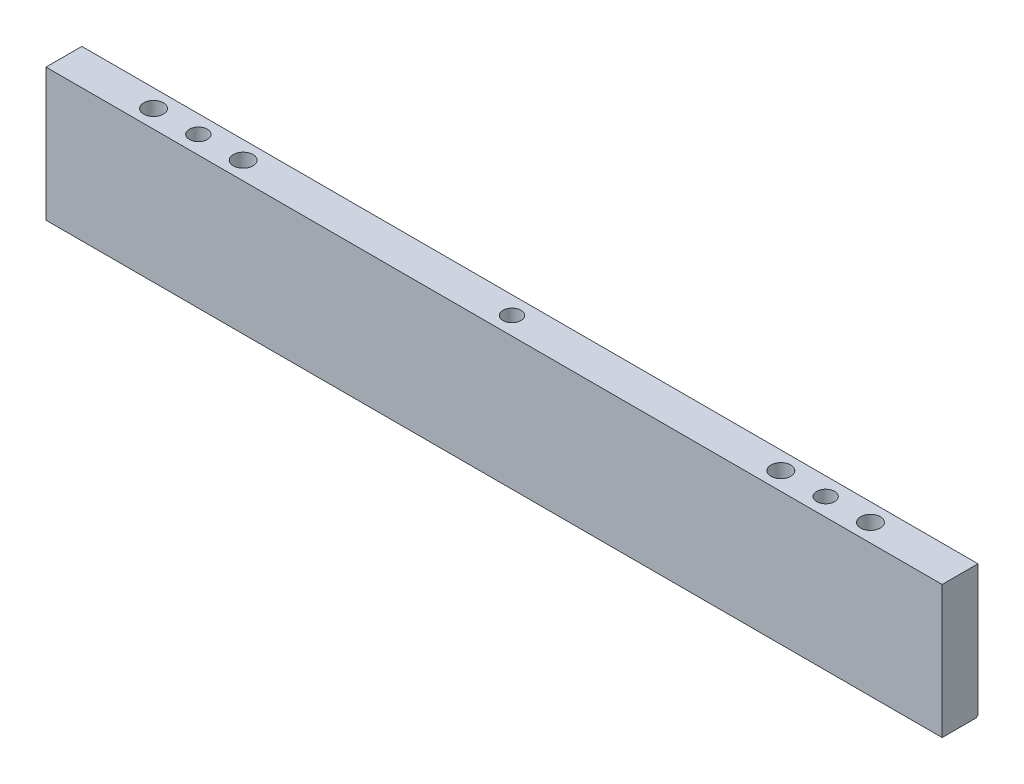
ISO-10303-21;
HEADER;
FILE_DESCRIPTION(('STEP AP214'),'2;1');
FILE_NAME('part.step','',(''),(''),'','','');
FILE_SCHEMA(('AUTOMOTIVE_DESIGN { 1 0 10303 214 1 1 1 1 }'));
ENDSEC;
DATA;
#1=APPLICATION_CONTEXT('core data for automotive mechanical design processes');
#2=APPLICATION_PROTOCOL_DEFINITION('international standard','automotive_design',2000,#1);
#3=PRODUCT_CONTEXT('',#1,'mechanical');
#4=PRODUCT('Part','Part','',(#3));
#5=PRODUCT_RELATED_PRODUCT_CATEGORY('part','',(#4));
#6=PRODUCT_DEFINITION_FORMATION('','',#4);
#7=PRODUCT_DEFINITION_CONTEXT('part definition',#1,'design');
#8=PRODUCT_DEFINITION('design','',#6,#7);
#9=PRODUCT_DEFINITION_SHAPE('','',#8);
#10=(LENGTH_UNIT() NAMED_UNIT(*) SI_UNIT(.MILLI.,.METRE.));
#11=(NAMED_UNIT(*) PLANE_ANGLE_UNIT() SI_UNIT($,.RADIAN.));
#12=(NAMED_UNIT(*) SI_UNIT($,.STERADIAN.) SOLID_ANGLE_UNIT());
#13=UNCERTAINTY_MEASURE_WITH_UNIT(LENGTH_MEASURE(1.E-05),#10,'distance_accuracy_value','');
#14=(GEOMETRIC_REPRESENTATION_CONTEXT(3) GLOBAL_UNCERTAINTY_ASSIGNED_CONTEXT((#13)) GLOBAL_UNIT_ASSIGNED_CONTEXT((#10,
#11,#12)) REPRESENTATION_CONTEXT('',''));
#15=CARTESIAN_POINT('',(0.,0.,0.));
#16=DIRECTION('',(0.,0.,1.));
#17=DIRECTION('',(1.,0.,0.));
#18=AXIS2_PLACEMENT_3D('',#15,#16,#17);
#19=CARTESIAN_POINT('',(425.,0.,10.));
#20=DIRECTION('',(0.,1.,0.));
#21=DIRECTION('',(0.,0.,1.));
#22=AXIS2_PLACEMENT_3D('',#19,#20,#21);
#23=CYLINDRICAL_SURFACE('',#22,5.);
#24=CARTESIAN_POINT('',(425.,0.,10.));
#25=DIRECTION('',(0.,1.,0.));
#26=DIRECTION('',(0.,0.,1.));
#27=AXIS2_PLACEMENT_3D('',#24,#25,#26);
#28=CIRCLE('',#27,5.);
#29=CARTESIAN_POINT('',(425.,0.,15.));
#30=VERTEX_POINT('',#29);
#31=EDGE_CURVE('E293',#30,#30,#28,.T.);
#32=ORIENTED_EDGE('',*,*,#31,.F.);
#33=EDGE_LOOP('',(#32));
#34=FACE_BOUND('',#33,.T.);
#35=CARTESIAN_POINT('',(425.,15.,10.));
#36=DIRECTION('',(0.,-1.,0.));
#37=DIRECTION('',(0.,0.,1.));
#38=AXIS2_PLACEMENT_3D('',#35,#36,#37);
#39=CIRCLE('',#38,5.);
#40=CARTESIAN_POINT('',(425.,15.,15.));
#41=VERTEX_POINT('',#40);
#42=EDGE_CURVE('E11',#41,#41,#39,.T.);
#43=ORIENTED_EDGE('',*,*,#42,.F.);
#44=EDGE_LOOP('',(#43));
#45=FACE_BOUND('',#44,.T.);
#46=ADVANCED_FACE('F16',(#34,#45),#23,.F.);
#47=CARTESIAN_POINT('',(425.,15.,10.));
#48=DIRECTION('',(0.,-1.,0.));
#49=DIRECTION('',(0.,0.,-1.));
#50=AXIS2_PLACEMENT_3D('',#47,#48,#49);
#51=CONICAL_SURFACE('',#50,5.,1.0297442575);
#52=CARTESIAN_POINT('',(425.,18.0043030951378,10.));
#53=VERTEX_POINT('',#52);
#54=VERTEX_LOOP('',#53);
#55=FACE_BOUND('',#54,.T.);
#56=ORIENTED_EDGE('',*,*,#42,.T.);
#57=EDGE_LOOP('',(#56));
#58=FACE_BOUND('',#57,.T.);
#59=ADVANCED_FACE('F368',(#55,#58),#51,.F.);
#60=CARTESIAN_POINT('',(75.,0.,10.));
#61=DIRECTION('',(0.,1.,0.));
#62=DIRECTION('',(0.,0.,1.));
#63=AXIS2_PLACEMENT_3D('',#60,#61,#62);
#64=CYLINDRICAL_SURFACE('',#63,5.);
#65=CARTESIAN_POINT('',(75.,0.,10.));
#66=DIRECTION('',(0.,1.,0.));
#67=DIRECTION('',(0.,0.,1.));
#68=AXIS2_PLACEMENT_3D('',#65,#66,#67);
#69=CIRCLE('',#68,5.);
#70=CARTESIAN_POINT('',(75.,0.,15.));
#71=VERTEX_POINT('',#70);
#72=EDGE_CURVE('E289',#71,#71,#69,.T.);
#73=ORIENTED_EDGE('',*,*,#72,.F.);
#74=EDGE_LOOP('',(#73));
#75=FACE_BOUND('',#74,.T.);
#76=CARTESIAN_POINT('',(75.,15.,10.));
#77=DIRECTION('',(0.,-1.,0.));
#78=DIRECTION('',(0.,0.,1.));
#79=AXIS2_PLACEMENT_3D('',#76,#77,#78);
#80=CIRCLE('',#79,5.);
#81=CARTESIAN_POINT('',(75.,15.,15.));
#82=VERTEX_POINT('',#81);
#83=EDGE_CURVE('E27',#82,#82,#80,.T.);
#84=ORIENTED_EDGE('',*,*,#83,.F.);
#85=EDGE_LOOP('',(#84));
#86=FACE_BOUND('',#85,.T.);
#87=ADVANCED_FACE('F374',(#75,#86),#64,.F.);
#88=CARTESIAN_POINT('',(75.,15.,10.));
#89=DIRECTION('',(0.,-1.,0.));
#90=DIRECTION('',(0.,0.,-1.));
#91=AXIS2_PLACEMENT_3D('',#88,#89,#90);
#92=CONICAL_SURFACE('',#91,5.,1.0297442575);
#93=CARTESIAN_POINT('',(75.,18.0043030951378,10.));
#94=VERTEX_POINT('',#93);
#95=VERTEX_LOOP('',#94);
#96=FACE_BOUND('',#95,.T.);
#97=ORIENTED_EDGE('',*,*,#83,.T.);
#98=EDGE_LOOP('',(#97));
#99=FACE_BOUND('',#98,.T.);
#100=ADVANCED_FACE('F351',(#96,#99),#92,.F.);
#101=CARTESIAN_POINT('',(425.,74.,10.));
#102=DIRECTION('',(0.,-1.,0.));
#103=DIRECTION('',(1.,0.,0.));
#104=AXIS2_PLACEMENT_3D('',#101,#102,#103);
#105=CYLINDRICAL_SURFACE('',#104,5.);
#106=CARTESIAN_POINT('',(425.,74.,10.));
#107=DIRECTION('',(0.,-1.,0.));
#108=DIRECTION('',(1.,0.,0.));
#109=AXIS2_PLACEMENT_3D('',#106,#107,#108);
#110=CIRCLE('',#109,5.);
#111=CARTESIAN_POINT('',(430.,74.,10.));
#112=VERTEX_POINT('',#111);
#113=EDGE_CURVE('E256',#112,#112,#110,.T.);
#114=ORIENTED_EDGE('',*,*,#113,.F.);
#115=EDGE_LOOP('',(#114));
#116=FACE_BOUND('',#115,.T.);
#117=CARTESIAN_POINT('',(425.,59.,10.));
#118=DIRECTION('',(0.,1.,0.));
#119=DIRECTION('',(1.,0.,0.));
#120=AXIS2_PLACEMENT_3D('',#117,#118,#119);
#121=CIRCLE('',#120,5.);
#122=CARTESIAN_POINT('',(430.,59.,10.));
#123=VERTEX_POINT('',#122);
#124=EDGE_CURVE('E259',#123,#123,#121,.T.);
#125=ORIENTED_EDGE('',*,*,#124,.F.);
#126=EDGE_LOOP('',(#125));
#127=FACE_BOUND('',#126,.T.);
#128=ADVANCED_FACE('F347',(#116,#127),#105,.F.);
#129=CARTESIAN_POINT('',(425.,59.,10.));
#130=DIRECTION('',(0.,1.,0.));
#131=DIRECTION('',(-1.,0.,0.));
#132=AXIS2_PLACEMENT_3D('',#129,#130,#131);
#133=CONICAL_SURFACE('',#132,5.,1.0297442575);
#134=CARTESIAN_POINT('',(425.,55.9956969048621,10.));
#135=VERTEX_POINT('',#134);
#136=VERTEX_LOOP('',#135);
#137=FACE_BOUND('',#136,.T.);
#138=ORIENTED_EDGE('',*,*,#124,.T.);
#139=EDGE_LOOP('',(#138));
#140=FACE_BOUND('',#139,.T.);
#141=ADVANCED_FACE('F350',(#137,#140),#133,.F.);
#142=CARTESIAN_POINT('',(250.,74.,10.));
#143=DIRECTION('',(0.,-1.,0.));
#144=DIRECTION('',(1.,0.,0.));
#145=AXIS2_PLACEMENT_3D('',#142,#143,#144);
#146=CYLINDRICAL_SURFACE('',#145,5.);
#147=CARTESIAN_POINT('',(250.,74.,10.));
#148=DIRECTION('',(0.,-1.,0.));
#149=DIRECTION('',(1.,0.,0.));
#150=AXIS2_PLACEMENT_3D('',#147,#148,#149);
#151=CIRCLE('',#150,5.);
#152=CARTESIAN_POINT('',(255.,74.,10.));
#153=VERTEX_POINT('',#152);
#154=EDGE_CURVE('E252',#153,#153,#151,.T.);
#155=ORIENTED_EDGE('',*,*,#154,.F.);
#156=EDGE_LOOP('',(#155));
#157=FACE_BOUND('',#156,.T.);
#158=CARTESIAN_POINT('',(250.,59.,10.));
#159=DIRECTION('',(0.,1.,0.));
#160=DIRECTION('',(1.,0.,0.));
#161=AXIS2_PLACEMENT_3D('',#158,#159,#160);
#162=CIRCLE('',#161,5.);
#163=CARTESIAN_POINT('',(255.,59.,10.));
#164=VERTEX_POINT('',#163);
#165=EDGE_CURVE('E262',#164,#164,#162,.T.);
#166=ORIENTED_EDGE('',*,*,#165,.F.);
#167=EDGE_LOOP('',(#166));
#168=FACE_BOUND('',#167,.T.);
#169=ADVANCED_FACE('F355',(#157,#168),#146,.F.);
#170=CARTESIAN_POINT('',(250.,59.,10.));
#171=DIRECTION('',(0.,1.,0.));
#172=DIRECTION('',(-1.,0.,0.));
#173=AXIS2_PLACEMENT_3D('',#170,#171,#172);
#174=CONICAL_SURFACE('',#173,5.,1.0297442575);
#175=CARTESIAN_POINT('',(250.,55.9956969048621,10.));
#176=VERTEX_POINT('',#175);
#177=VERTEX_LOOP('',#176);
#178=FACE_BOUND('',#177,.T.);
#179=ORIENTED_EDGE('',*,*,#165,.T.);
#180=EDGE_LOOP('',(#179));
#181=FACE_BOUND('',#180,.T.);
#182=ADVANCED_FACE('F362',(#178,#181),#174,.F.);
#183=CARTESIAN_POINT('',(75.,74.,10.));
#184=DIRECTION('',(0.,-1.,0.));
#185=DIRECTION('',(1.,0.,0.));
#186=AXIS2_PLACEMENT_3D('',#183,#184,#185);
#187=CYLINDRICAL_SURFACE('',#186,5.);
#188=CARTESIAN_POINT('',(75.,74.,10.));
#189=DIRECTION('',(0.,-1.,0.));
#190=DIRECTION('',(1.,0.,0.));
#191=AXIS2_PLACEMENT_3D('',#188,#189,#190);
#192=CIRCLE('',#191,5.);
#193=CARTESIAN_POINT('',(80.,74.,10.));
#194=VERTEX_POINT('',#193);
#195=EDGE_CURVE('E255',#194,#194,#192,.T.);
#196=ORIENTED_EDGE('',*,*,#195,.F.);
#197=EDGE_LOOP('',(#196));
#198=FACE_BOUND('',#197,.T.);
#199=CARTESIAN_POINT('',(75.,59.,10.));
#200=DIRECTION('',(0.,1.,0.));
#201=DIRECTION('',(1.,0.,0.));
#202=AXIS2_PLACEMENT_3D('',#199,#200,#201);
#203=CIRCLE('',#202,5.);
#204=CARTESIAN_POINT('',(80.,59.,10.));
#205=VERTEX_POINT('',#204);
#206=EDGE_CURVE('E296',#205,#205,#203,.T.);
#207=ORIENTED_EDGE('',*,*,#206,.F.);
#208=EDGE_LOOP('',(#207));
#209=FACE_BOUND('',#208,.T.);
#210=ADVANCED_FACE('F414',(#198,#209),#187,.F.);
#211=CARTESIAN_POINT('',(75.,59.,10.));
#212=DIRECTION('',(0.,1.,0.));
#213=DIRECTION('',(-1.,0.,0.));
#214=AXIS2_PLACEMENT_3D('',#211,#212,#213);
#215=CONICAL_SURFACE('',#214,5.,1.0297442575);
#216=CARTESIAN_POINT('',(75.,55.9956969048621,10.));
#217=VERTEX_POINT('',#216);
#218=VERTEX_LOOP('',#217);
#219=FACE_BOUND('',#218,.T.);
#220=ORIENTED_EDGE('',*,*,#206,.T.);
#221=EDGE_LOOP('',(#220));
#222=FACE_BOUND('',#221,.T.);
#223=ADVANCED_FACE('F410',(#219,#222),#215,.F.);
#224=CARTESIAN_POINT('',(450.,74.,10.));
#225=DIRECTION('',(0.,-1.,0.));
#226=DIRECTION('',(1.,0.,0.));
#227=AXIS2_PLACEMENT_3D('',#224,#225,#226);
#228=CYLINDRICAL_SURFACE('',#227,5.5);
#229=CARTESIAN_POINT('',(450.,74.,10.));
#230=DIRECTION('',(0.,-1.,0.));
#231=DIRECTION('',(1.,0.,0.));
#232=AXIS2_PLACEMENT_3D('',#229,#230,#231);
#233=CIRCLE('',#232,5.5);
#234=CARTESIAN_POINT('',(455.5,74.,10.));
#235=VERTEX_POINT('',#234);
#236=EDGE_CURVE('E286',#235,#235,#233,.T.);
#237=ORIENTED_EDGE('',*,*,#236,.F.);
#238=EDGE_LOOP('',(#237));
#239=FACE_BOUND('',#238,.T.);
#240=CARTESIAN_POINT('',(450.,3.99999999999989,10.));
#241=DIRECTION('',(0.,1.,0.));
#242=DIRECTION('',(1.,0.,0.));
#243=AXIS2_PLACEMENT_3D('',#240,#241,#242);
#244=CIRCLE('',#243,5.5);
#245=CARTESIAN_POINT('',(455.5,3.99999999999989,10.));
#246=VERTEX_POINT('',#245);
#247=EDGE_CURVE('E237',#246,#246,#244,.T.);
#248=ORIENTED_EDGE('',*,*,#247,.F.);
#249=EDGE_LOOP('',(#248));
#250=FACE_BOUND('',#249,.T.);
#251=ADVANCED_FACE('F413',(#239,#250),#228,.F.);
#252=CARTESIAN_POINT('',(450.,3.99999999999989,10.));
#253=DIRECTION('',(0.,-1.,0.));
#254=DIRECTION('',(0.,0.,-1.));
#255=AXIS2_PLACEMENT_3D('',#252,#253,#254);
#256=PLANE('',#255);
#257=ORIENTED_EDGE('',*,*,#247,.T.);
#258=EDGE_LOOP('',(#257));
#259=FACE_BOUND('',#258,.T.);
#260=CARTESIAN_POINT('',(450.,3.99999999999989,10.));
#261=DIRECTION('',(0.,1.,0.));
#262=DIRECTION('',(1.,0.,0.));
#263=AXIS2_PLACEMENT_3D('',#260,#261,#262);
#264=CIRCLE('',#263,3.3);
#265=CARTESIAN_POINT('',(453.3,3.99999999999989,10.));
#266=VERTEX_POINT('',#265);
#267=EDGE_CURVE('E235',#266,#266,#264,.T.);
#268=ORIENTED_EDGE('',*,*,#267,.F.);
#269=EDGE_LOOP('',(#268));
#270=FACE_BOUND('',#269,.T.);
#271=ADVANCED_FACE('F431',(#259,#270),#256,.F.);
#272=CARTESIAN_POINT('',(450.,-156.397233692729,10.));
#273=DIRECTION('',(0.,-1.,0.));
#274=DIRECTION('',(1.,0.,0.));
#275=AXIS2_PLACEMENT_3D('',#272,#273,#274);
#276=CYLINDRICAL_SURFACE('',#275,3.3);
#277=CARTESIAN_POINT('',(450.,0.,10.));
#278=DIRECTION('',(0.,1.,0.));
#279=DIRECTION('',(0.,0.,1.));
#280=AXIS2_PLACEMENT_3D('',#277,#278,#279);
#281=CIRCLE('',#280,3.3);
#282=CARTESIAN_POINT('',(450.,0.,13.3));
#283=VERTEX_POINT('',#282);
#284=EDGE_CURVE('E292',#283,#283,#281,.T.);
#285=ORIENTED_EDGE('',*,*,#284,.F.);
#286=EDGE_LOOP('',(#285));
#287=FACE_BOUND('',#286,.T.);
#288=ORIENTED_EDGE('',*,*,#267,.T.);
#289=EDGE_LOOP('',(#288));
#290=FACE_BOUND('',#289,.T.);
#291=ADVANCED_FACE('F427',(#287,#290),#276,.F.);
#292=CARTESIAN_POINT('',(400.,74.,10.));
#293=DIRECTION('',(0.,-1.,0.));
#294=DIRECTION('',(1.,0.,0.));
#295=AXIS2_PLACEMENT_3D('',#292,#293,#294);
#296=CYLINDRICAL_SURFACE('',#295,5.5);
#297=CARTESIAN_POINT('',(400.,74.,10.));
#298=DIRECTION('',(0.,-1.,0.));
#299=DIRECTION('',(1.,0.,0.));
#300=AXIS2_PLACEMENT_3D('',#297,#298,#299);
#301=CIRCLE('',#300,5.5);
#302=CARTESIAN_POINT('',(405.5,74.,10.));
#303=VERTEX_POINT('',#302);
#304=EDGE_CURVE('E251',#303,#303,#301,.T.);
#305=ORIENTED_EDGE('',*,*,#304,.F.);
#306=EDGE_LOOP('',(#305));
#307=FACE_BOUND('',#306,.T.);
#308=CARTESIAN_POINT('',(400.,3.99999999999989,10.));
#309=DIRECTION('',(0.,1.,0.));
#310=DIRECTION('',(1.,0.,0.));
#311=AXIS2_PLACEMENT_3D('',#308,#309,#310);
#312=CIRCLE('',#311,5.5);
#313=CARTESIAN_POINT('',(405.5,3.99999999999989,10.));
#314=VERTEX_POINT('',#313);
#315=EDGE_CURVE('E238',#314,#314,#312,.T.);
#316=ORIENTED_EDGE('',*,*,#315,.F.);
#317=EDGE_LOOP('',(#316));
#318=FACE_BOUND('',#317,.T.);
#319=ADVANCED_FACE('F424',(#307,#318),#296,.F.);
#320=CARTESIAN_POINT('',(400.,3.99999999999989,10.));
#321=DIRECTION('',(0.,-1.,0.));
#322=DIRECTION('',(0.,0.,-1.));
#323=AXIS2_PLACEMENT_3D('',#320,#321,#322);
#324=PLANE('',#323);
#325=ORIENTED_EDGE('',*,*,#315,.T.);
#326=EDGE_LOOP('',(#325));
#327=FACE_BOUND('',#326,.T.);
#328=CARTESIAN_POINT('',(400.,3.99999999999989,10.));
#329=DIRECTION('',(0.,1.,0.));
#330=DIRECTION('',(1.,0.,0.));
#331=AXIS2_PLACEMENT_3D('',#328,#329,#330);
#332=CIRCLE('',#331,3.3);
#333=CARTESIAN_POINT('',(403.3,3.99999999999989,10.));
#334=VERTEX_POINT('',#333);
#335=EDGE_CURVE('E274',#334,#334,#332,.T.);
#336=ORIENTED_EDGE('',*,*,#335,.F.);
#337=EDGE_LOOP('',(#336));
#338=FACE_BOUND('',#337,.T.);
#339=ADVANCED_FACE('F404',(#327,#338),#324,.F.);
#340=CARTESIAN_POINT('',(400.,-197.312803747469,10.));
#341=DIRECTION('',(0.,-1.,0.));
#342=DIRECTION('',(1.,0.,0.));
#343=AXIS2_PLACEMENT_3D('',#340,#341,#342);
#344=CYLINDRICAL_SURFACE('',#343,3.3);
#345=CARTESIAN_POINT('',(400.,0.,10.));
#346=DIRECTION('',(0.,1.,0.));
#347=DIRECTION('',(0.,0.,1.));
#348=AXIS2_PLACEMENT_3D('',#345,#346,#347);
#349=CIRCLE('',#348,3.3);
#350=CARTESIAN_POINT('',(400.,0.,13.3));
#351=VERTEX_POINT('',#350);
#352=EDGE_CURVE('E233',#351,#351,#349,.T.);
#353=ORIENTED_EDGE('',*,*,#352,.F.);
#354=EDGE_LOOP('',(#353));
#355=FACE_BOUND('',#354,.T.);
#356=ORIENTED_EDGE('',*,*,#335,.T.);
#357=EDGE_LOOP('',(#356));
#358=FACE_BOUND('',#357,.T.);
#359=ADVANCED_FACE('F393',(#355,#358),#344,.F.);
#360=CARTESIAN_POINT('',(100.,74.,10.));
#361=DIRECTION('',(0.,-1.,0.));
#362=DIRECTION('',(1.,0.,0.));
#363=AXIS2_PLACEMENT_3D('',#360,#361,#362);
#364=CYLINDRICAL_SURFACE('',#363,5.5);
#365=CARTESIAN_POINT('',(100.,74.,10.));
#366=DIRECTION('',(0.,-1.,0.));
#367=DIRECTION('',(1.,0.,0.));
#368=AXIS2_PLACEMENT_3D('',#365,#366,#367);
#369=CIRCLE('',#368,5.5);
#370=CARTESIAN_POINT('',(105.5,74.,10.));
#371=VERTEX_POINT('',#370);
#372=EDGE_CURVE('E246',#371,#371,#369,.T.);
#373=ORIENTED_EDGE('',*,*,#372,.F.);
#374=EDGE_LOOP('',(#373));
#375=FACE_BOUND('',#374,.T.);
#376=CARTESIAN_POINT('',(100.,3.99999999999989,10.));
#377=DIRECTION('',(0.,1.,0.));
#378=DIRECTION('',(1.,0.,0.));
#379=AXIS2_PLACEMENT_3D('',#376,#377,#378);
#380=CIRCLE('',#379,5.5);
#381=CARTESIAN_POINT('',(105.5,3.99999999999989,10.));
#382=VERTEX_POINT('',#381);
#383=EDGE_CURVE('E279',#382,#382,#380,.T.);
#384=ORIENTED_EDGE('',*,*,#383,.F.);
#385=EDGE_LOOP('',(#384));
#386=FACE_BOUND('',#385,.T.);
#387=ADVANCED_FACE('F385',(#375,#386),#364,.F.);
#388=CARTESIAN_POINT('',(100.,3.99999999999989,10.));
#389=DIRECTION('',(0.,-1.,0.));
#390=DIRECTION('',(0.,0.,-1.));
#391=AXIS2_PLACEMENT_3D('',#388,#389,#390);
#392=PLANE('',#391);
#393=ORIENTED_EDGE('',*,*,#383,.T.);
#394=EDGE_LOOP('',(#393));
#395=FACE_BOUND('',#394,.T.);
#396=CARTESIAN_POINT('',(100.,3.99999999999989,10.));
#397=DIRECTION('',(0.,1.,0.));
#398=DIRECTION('',(1.,0.,0.));
#399=AXIS2_PLACEMENT_3D('',#396,#397,#398);
#400=CIRCLE('',#399,3.3);
#401=CARTESIAN_POINT('',(103.3,3.99999999999989,10.));
#402=VERTEX_POINT('',#401);
#403=EDGE_CURVE('E276',#402,#402,#400,.T.);
#404=ORIENTED_EDGE('',*,*,#403,.F.);
#405=EDGE_LOOP('',(#404));
#406=FACE_BOUND('',#405,.T.);
#407=ADVANCED_FACE('F382',(#395,#406),#392,.F.);
#408=CARTESIAN_POINT('',(100.,-197.312803747469,10.));
#409=DIRECTION('',(0.,-1.,0.));
#410=DIRECTION('',(1.,0.,0.));
#411=AXIS2_PLACEMENT_3D('',#408,#409,#410);
#412=CYLINDRICAL_SURFACE('',#411,3.3);
#413=CARTESIAN_POINT('',(100.,0.,10.));
#414=DIRECTION('',(0.,1.,0.));
#415=DIRECTION('',(0.,0.,1.));
#416=AXIS2_PLACEMENT_3D('',#413,#414,#415);
#417=CIRCLE('',#416,3.3);
#418=CARTESIAN_POINT('',(100.,0.,13.3));
#419=VERTEX_POINT('',#418);
#420=EDGE_CURVE('E242',#419,#419,#417,.T.);
#421=ORIENTED_EDGE('',*,*,#420,.F.);
#422=EDGE_LOOP('',(#421));
#423=FACE_BOUND('',#422,.T.);
#424=ORIENTED_EDGE('',*,*,#403,.T.);
#425=EDGE_LOOP('',(#424));
#426=FACE_BOUND('',#425,.T.);
#427=ADVANCED_FACE('F384',(#423,#426),#412,.F.);
#428=CARTESIAN_POINT('',(50.,74.,10.));
#429=DIRECTION('',(0.,-1.,0.));
#430=DIRECTION('',(1.,0.,0.));
#431=AXIS2_PLACEMENT_3D('',#428,#429,#430);
#432=CYLINDRICAL_SURFACE('',#431,5.5);
#433=CARTESIAN_POINT('',(50.,74.,10.));
#434=DIRECTION('',(0.,-1.,0.));
#435=DIRECTION('',(1.,0.,0.));
#436=AXIS2_PLACEMENT_3D('',#433,#434,#435);
#437=CIRCLE('',#436,5.5);
#438=CARTESIAN_POINT('',(55.5,74.,10.));
#439=VERTEX_POINT('',#438);
#440=EDGE_CURVE('E250',#439,#439,#437,.T.);
#441=ORIENTED_EDGE('',*,*,#440,.F.);
#442=EDGE_LOOP('',(#441));
#443=FACE_BOUND('',#442,.T.);
#444=CARTESIAN_POINT('',(50.,3.99999999999989,10.));
#445=DIRECTION('',(0.,1.,0.));
#446=DIRECTION('',(1.,0.,0.));
#447=AXIS2_PLACEMENT_3D('',#444,#445,#446);
#448=CIRCLE('',#447,5.5);
#449=CARTESIAN_POINT('',(55.5,3.99999999999989,10.));
#450=VERTEX_POINT('',#449);
#451=EDGE_CURVE('E280',#450,#450,#448,.T.);
#452=ORIENTED_EDGE('',*,*,#451,.F.);
#453=EDGE_LOOP('',(#452));
#454=FACE_BOUND('',#453,.T.);
#455=ADVANCED_FACE('F380',(#443,#454),#432,.F.);
#456=CARTESIAN_POINT('',(50.,3.99999999999989,10.));
#457=DIRECTION('',(0.,-1.,0.));
#458=DIRECTION('',(0.,0.,-1.));
#459=AXIS2_PLACEMENT_3D('',#456,#457,#458);
#460=PLANE('',#459);
#461=ORIENTED_EDGE('',*,*,#451,.T.);
#462=EDGE_LOOP('',(#461));
#463=FACE_BOUND('',#462,.T.);
#464=CARTESIAN_POINT('',(50.,3.99999999999989,10.));
#465=DIRECTION('',(0.,1.,0.));
#466=DIRECTION('',(1.,0.,0.));
#467=AXIS2_PLACEMENT_3D('',#464,#465,#466);
#468=CIRCLE('',#467,3.3);
#469=CARTESIAN_POINT('',(53.3,3.99999999999989,10.));
#470=VERTEX_POINT('',#469);
#471=EDGE_CURVE('E206',#470,#470,#468,.T.);
#472=ORIENTED_EDGE('',*,*,#471,.F.);
#473=EDGE_LOOP('',(#472));
#474=FACE_BOUND('',#473,.T.);
#475=ADVANCED_FACE('F436',(#463,#474),#460,.F.);
#476=CARTESIAN_POINT('',(50.,-156.397233692729,10.));
#477=DIRECTION('',(0.,-1.,0.));
#478=DIRECTION('',(1.,0.,0.));
#479=AXIS2_PLACEMENT_3D('',#476,#477,#478);
#480=CYLINDRICAL_SURFACE('',#479,3.3);
#481=CARTESIAN_POINT('',(50.,0.,10.));
#482=DIRECTION('',(0.,1.,0.));
#483=DIRECTION('',(0.,0.,1.));
#484=AXIS2_PLACEMENT_3D('',#481,#482,#483);
#485=CIRCLE('',#484,3.3);
#486=CARTESIAN_POINT('',(50.,0.,13.3));
#487=VERTEX_POINT('',#486);
#488=EDGE_CURVE('E239',#487,#487,#485,.T.);
#489=ORIENTED_EDGE('',*,*,#488,.F.);
#490=EDGE_LOOP('',(#489));
#491=FACE_BOUND('',#490,.T.);
#492=ORIENTED_EDGE('',*,*,#471,.T.);
#493=EDGE_LOOP('',(#492));
#494=FACE_BOUND('',#493,.T.);
#495=ADVANCED_FACE('F18',(#491,#494),#480,.F.);
#496=CARTESIAN_POINT('',(0.,0.,1.));
#497=DIRECTION('',(0.,0.707106781186548,0.707106781186547));
#498=DIRECTION('',(1.,0.,0.));
#499=AXIS2_PLACEMENT_3D('',#496,#497,#498);
#500=PLANE('',#499);
#501=DIRECTION('',(0.,-0.707106781186547,0.707106781186548));
#502=VECTOR('',#501,1.);
#503=CARTESIAN_POINT('',(0.,0.,1.));
#504=LINE('',#503,#502);
#505=CARTESIAN_POINT('',(0.,1.,0.));
#506=VERTEX_POINT('',#505);
#507=CARTESIAN_POINT('',(0.,0.,1.));
#508=VERTEX_POINT('',#507);
#509=EDGE_CURVE('E202',#506,#508,#504,.T.);
#510=ORIENTED_EDGE('',*,*,#509,.F.);
#511=DIRECTION('',(-1.,0.,0.));
#512=VECTOR('',#511,1.);
#513=CARTESIAN_POINT('',(0.,1.,0.));
#514=LINE('',#513,#512);
#515=CARTESIAN_POINT('',(500.,1.,0.));
#516=VERTEX_POINT('',#515);
#517=EDGE_CURVE('E195',#516,#506,#514,.T.);
#518=ORIENTED_EDGE('',*,*,#517,.F.);
#519=DIRECTION('',(0.,0.707106781186547,-0.707106781186548));
#520=VECTOR('',#519,1.);
#521=CARTESIAN_POINT('',(500.,0.,1.));
#522=LINE('',#521,#520);
#523=CARTESIAN_POINT('',(500.,0.,1.));
#524=VERTEX_POINT('',#523);
#525=EDGE_CURVE('E200',#524,#516,#522,.T.);
#526=ORIENTED_EDGE('',*,*,#525,.F.);
#527=DIRECTION('',(1.,0.,0.));
#528=VECTOR('',#527,1.);
#529=CARTESIAN_POINT('',(0.,0.,1.));
#530=LINE('',#529,#528);
#531=EDGE_CURVE('E283',#508,#524,#530,.T.);
#532=ORIENTED_EDGE('',*,*,#531,.F.);
#533=EDGE_LOOP('',(#510,#518,#526,#532));
#534=FACE_BOUND('',#533,.T.);
#535=ADVANCED_FACE('F197',(#534),#500,.F.);
#536=CARTESIAN_POINT('',(0.,0.,0.));
#537=DIRECTION('',(0.,0.,1.));
#538=DIRECTION('',(1.,0.,0.));
#539=AXIS2_PLACEMENT_3D('',#536,#537,#538);
#540=PLANE('',#539);
#541=DIRECTION('',(0.,1.,0.));
#542=VECTOR('',#541,1.);
#543=CARTESIAN_POINT('',(500.,0.,0.));
#544=LINE('',#543,#542);
#545=CARTESIAN_POINT('',(500.,74.,0.));
#546=VERTEX_POINT('',#545);
#547=EDGE_CURVE('E210',#516,#546,#544,.T.);
#548=ORIENTED_EDGE('',*,*,#547,.F.);
#549=ORIENTED_EDGE('',*,*,#517,.T.);
#550=DIRECTION('',(0.,-1.,0.));
#551=VECTOR('',#550,1.);
#552=CARTESIAN_POINT('',(0.,74.,0.));
#553=LINE('',#552,#551);
#554=CARTESIAN_POINT('',(0.,74.,0.));
#555=VERTEX_POINT('',#554);
#556=EDGE_CURVE('E272',#555,#506,#553,.T.);
#557=ORIENTED_EDGE('',*,*,#556,.F.);
#558=DIRECTION('',(-1.,0.,0.));
#559=VECTOR('',#558,1.);
#560=CARTESIAN_POINT('',(500.,74.,0.));
#561=LINE('',#560,#559);
#562=EDGE_CURVE('E213',#546,#555,#561,.T.);
#563=ORIENTED_EDGE('',*,*,#562,.F.);
#564=EDGE_LOOP('',(#548,#549,#557,#563));
#565=FACE_BOUND('',#564,.T.);
#566=ADVANCED_FACE('F211',(#565),#540,.F.);
#567=CARTESIAN_POINT('',(0.,0.,20.));
#568=DIRECTION('',(0.,0.,1.));
#569=DIRECTION('',(1.,0.,0.));
#570=AXIS2_PLACEMENT_3D('',#567,#568,#569);
#571=PLANE('',#570);
#572=DIRECTION('',(1.,0.,0.));
#573=VECTOR('',#572,1.);
#574=CARTESIAN_POINT('',(0.,0.,20.));
#575=LINE('',#574,#573);
#576=CARTESIAN_POINT('',(0.,0.,20.));
#577=VERTEX_POINT('',#576);
#578=CARTESIAN_POINT('',(500.,0.,20.));
#579=VERTEX_POINT('',#578);
#580=EDGE_CURVE('E20',#577,#579,#575,.T.);
#581=ORIENTED_EDGE('',*,*,#580,.T.);
#582=DIRECTION('',(0.,1.,0.));
#583=VECTOR('',#582,1.);
#584=CARTESIAN_POINT('',(500.,0.,20.));
#585=LINE('',#584,#583);
#586=CARTESIAN_POINT('',(500.,74.,20.));
#587=VERTEX_POINT('',#586);
#588=EDGE_CURVE('E333',#579,#587,#585,.T.);
#589=ORIENTED_EDGE('',*,*,#588,.T.);
#590=DIRECTION('',(-1.,0.,0.));
#591=VECTOR('',#590,1.);
#592=CARTESIAN_POINT('',(500.,74.,20.));
#593=LINE('',#592,#591);
#594=CARTESIAN_POINT('',(0.,74.,20.));
#595=VERTEX_POINT('',#594);
#596=EDGE_CURVE('E269',#587,#595,#593,.T.);
#597=ORIENTED_EDGE('',*,*,#596,.T.);
#598=DIRECTION('',(0.,-1.,0.));
#599=VECTOR('',#598,1.);
#600=CARTESIAN_POINT('',(0.,74.,20.));
#601=LINE('',#600,#599);
#602=EDGE_CURVE('E207',#595,#577,#601,.T.);
#603=ORIENTED_EDGE('',*,*,#602,.T.);
#604=EDGE_LOOP('',(#581,#589,#597,#603));
#605=FACE_BOUND('',#604,.T.);
#606=ADVANCED_FACE('F419',(#605),#571,.T.);
#607=CARTESIAN_POINT('',(0.,74.,20.));
#608=DIRECTION('',(1.,0.,0.));
#609=DIRECTION('',(0.,1.,0.));
#610=AXIS2_PLACEMENT_3D('',#607,#608,#609);
#611=PLANE('',#610);
#612=ORIENTED_EDGE('',*,*,#556,.T.);
#613=ORIENTED_EDGE('',*,*,#509,.T.);
#614=DIRECTION('',(0.,0.,-1.));
#615=VECTOR('',#614,1.);
#616=CARTESIAN_POINT('',(0.,0.,20.));
#617=LINE('',#616,#615);
#618=EDGE_CURVE('E241',#577,#508,#617,.T.);
#619=ORIENTED_EDGE('',*,*,#618,.F.);
#620=ORIENTED_EDGE('',*,*,#602,.F.);
#621=DIRECTION('',(0.,0.,-1.));
#622=VECTOR('',#621,1.);
#623=CARTESIAN_POINT('',(0.,74.,20.));
#624=LINE('',#623,#622);
#625=EDGE_CURVE('E265',#595,#555,#624,.T.);
#626=ORIENTED_EDGE('',*,*,#625,.T.);
#627=EDGE_LOOP('',(#612,#613,#619,#620,#626));
#628=FACE_BOUND('',#627,.T.);
#629=ADVANCED_FACE('F416',(#628),#611,.F.);
#630=CARTESIAN_POINT('',(500.,74.,20.));
#631=DIRECTION('',(0.,-1.,0.));
#632=DIRECTION('',(0.,0.,-1.));
#633=AXIS2_PLACEMENT_3D('',#630,#631,#632);
#634=PLANE('',#633);
#635=ORIENTED_EDGE('',*,*,#562,.T.);
#636=ORIENTED_EDGE('',*,*,#625,.F.);
#637=ORIENTED_EDGE('',*,*,#596,.F.);
#638=DIRECTION('',(0.,0.,-1.));
#639=VECTOR('',#638,1.);
#640=CARTESIAN_POINT('',(500.,74.,20.));
#641=LINE('',#640,#639);
#642=EDGE_CURVE('E218',#587,#546,#641,.T.);
#643=ORIENTED_EDGE('',*,*,#642,.T.);
#644=EDGE_LOOP('',(#635,#636,#637,#643));
#645=FACE_BOUND('',#644,.T.);
#646=ORIENTED_EDGE('',*,*,#440,.T.);
#647=EDGE_LOOP('',(#646));
#648=FACE_BOUND('',#647,.T.);
#649=ORIENTED_EDGE('',*,*,#372,.T.);
#650=EDGE_LOOP('',(#649));
#651=FACE_BOUND('',#650,.T.);
#652=ORIENTED_EDGE('',*,*,#304,.T.);
#653=EDGE_LOOP('',(#652));
#654=FACE_BOUND('',#653,.T.);
#655=ORIENTED_EDGE('',*,*,#236,.T.);
#656=EDGE_LOOP('',(#655));
#657=FACE_BOUND('',#656,.T.);
#658=ORIENTED_EDGE('',*,*,#195,.T.);
#659=EDGE_LOOP('',(#658));
#660=FACE_BOUND('',#659,.T.);
#661=ORIENTED_EDGE('',*,*,#154,.T.);
#662=EDGE_LOOP('',(#661));
#663=FACE_BOUND('',#662,.T.);
#664=ORIENTED_EDGE('',*,*,#113,.T.);
#665=EDGE_LOOP('',(#664));
#666=FACE_BOUND('',#665,.T.);
#667=ADVANCED_FACE('F345',(#645,#648,#651,#654,#657,#660,#663,#666),#634,.F.);
#668=CARTESIAN_POINT('',(500.,0.,20.));
#669=DIRECTION('',(-1.,0.,0.));
#670=DIRECTION('',(0.,0.,1.));
#671=AXIS2_PLACEMENT_3D('',#668,#669,#670);
#672=PLANE('',#671);
#673=DIRECTION('',(0.,0.,-1.));
#674=VECTOR('',#673,1.);
#675=CARTESIAN_POINT('',(500.,0.,20.));
#676=LINE('',#675,#674);
#677=EDGE_CURVE('E222',#579,#524,#676,.T.);
#678=ORIENTED_EDGE('',*,*,#677,.T.);
#679=ORIENTED_EDGE('',*,*,#525,.T.);
#680=ORIENTED_EDGE('',*,*,#547,.T.);
#681=ORIENTED_EDGE('',*,*,#642,.F.);
#682=ORIENTED_EDGE('',*,*,#588,.F.);
#683=EDGE_LOOP('',(#678,#679,#680,#681,#682));
#684=FACE_BOUND('',#683,.T.);
#685=ADVANCED_FACE('F220',(#684),#672,.F.);
#686=CARTESIAN_POINT('',(0.,0.,20.));
#687=DIRECTION('',(0.,1.,0.));
#688=DIRECTION('',(1.,0.,0.));
#689=AXIS2_PLACEMENT_3D('',#686,#687,#688);
#690=PLANE('',#689);
#691=ORIENTED_EDGE('',*,*,#618,.T.);
#692=ORIENTED_EDGE('',*,*,#531,.T.);
#693=ORIENTED_EDGE('',*,*,#677,.F.);
#694=ORIENTED_EDGE('',*,*,#580,.F.);
#695=EDGE_LOOP('',(#691,#692,#693,#694));
#696=FACE_BOUND('',#695,.T.);
#697=ORIENTED_EDGE('',*,*,#488,.T.);
#698=EDGE_LOOP('',(#697));
#699=FACE_BOUND('',#698,.T.);
#700=ORIENTED_EDGE('',*,*,#420,.T.);
#701=EDGE_LOOP('',(#700));
#702=FACE_BOUND('',#701,.T.);
#703=ORIENTED_EDGE('',*,*,#352,.T.);
#704=EDGE_LOOP('',(#703));
#705=FACE_BOUND('',#704,.T.);
#706=ORIENTED_EDGE('',*,*,#284,.T.);
#707=EDGE_LOOP('',(#706));
#708=FACE_BOUND('',#707,.T.);
#709=ORIENTED_EDGE('',*,*,#72,.T.);
#710=EDGE_LOOP('',(#709));
#711=FACE_BOUND('',#710,.T.);
#712=ORIENTED_EDGE('',*,*,#31,.T.);
#713=EDGE_LOOP('',(#712));
#714=FACE_BOUND('',#713,.T.);
#715=ADVANCED_FACE('F457',(#696,#699,#702,#705,#708,#711,#714),#690,.F.);
#716=CLOSED_SHELL('',(#46,#59,#87,#100,#128,#141,#169,#182,#210,#223,#251,#271,#291,#319,#339,
#359,#387,#407,#427,#455,#475,#495,#535,#566,#606,#629,#667,#685,#715));
#717=MANIFOLD_SOLID_BREP('B1',#716);
#718=ADVANCED_BREP_SHAPE_REPRESENTATION('',(#18,#717),#14);
#719=SHAPE_DEFINITION_REPRESENTATION(#9,#718);
ENDSEC;
END-ISO-10303-21;
